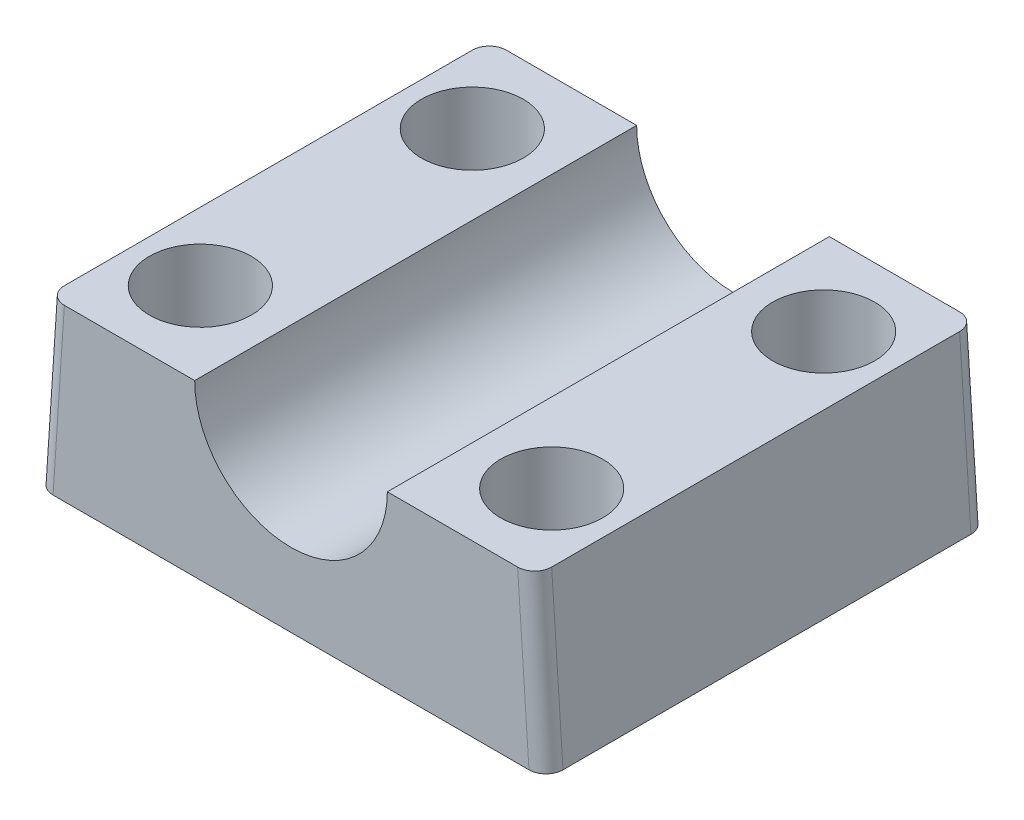
ISO-10303-21;
HEADER;
FILE_DESCRIPTION(('STEP AP214'),'2;1');
FILE_NAME('part.step','',(''),(''),'','','');
FILE_SCHEMA(('AUTOMOTIVE_DESIGN { 1 0 10303 214 1 1 1 1 }'));
ENDSEC;
DATA;
#1=APPLICATION_CONTEXT('core data for automotive mechanical design processes');
#2=APPLICATION_PROTOCOL_DEFINITION('international standard','automotive_design',2000,#1);
#3=PRODUCT_CONTEXT('',#1,'mechanical');
#4=PRODUCT('Part','Part','',(#3));
#5=PRODUCT_RELATED_PRODUCT_CATEGORY('part','',(#4));
#6=PRODUCT_DEFINITION_FORMATION('','',#4);
#7=PRODUCT_DEFINITION_CONTEXT('part definition',#1,'design');
#8=PRODUCT_DEFINITION('design','',#6,#7);
#9=PRODUCT_DEFINITION_SHAPE('','',#8);
#10=(LENGTH_UNIT() NAMED_UNIT(*) SI_UNIT(.MILLI.,.METRE.));
#11=(NAMED_UNIT(*) PLANE_ANGLE_UNIT() SI_UNIT($,.RADIAN.));
#12=(NAMED_UNIT(*) SI_UNIT($,.STERADIAN.) SOLID_ANGLE_UNIT());
#13=UNCERTAINTY_MEASURE_WITH_UNIT(LENGTH_MEASURE(1.E-05),#10,'distance_accuracy_value','');
#14=(GEOMETRIC_REPRESENTATION_CONTEXT(3) GLOBAL_UNCERTAINTY_ASSIGNED_CONTEXT((#13)) GLOBAL_UNIT_ASSIGNED_CONTEXT((#10,
#11,#12)) REPRESENTATION_CONTEXT('',''));
#15=CARTESIAN_POINT('',(0.,0.,0.));
#16=DIRECTION('',(0.,0.,1.));
#17=DIRECTION('',(1.,0.,0.));
#18=AXIS2_PLACEMENT_3D('',#15,#16,#17);
#19=CARTESIAN_POINT('',(0.,15.,39.));
#20=DIRECTION('',(0.,0.,-1.));
#21=DIRECTION('',(-1.,0.,0.));
#22=AXIS2_PLACEMENT_3D('',#19,#20,#21);
#23=CYLINDRICAL_SURFACE('',#22,8.5);
#24=CARTESIAN_POINT('',(0.,15.,0.));
#25=DIRECTION('',(0.,0.,-1.));
#26=DIRECTION('',(1.,0.,0.));
#27=AXIS2_PLACEMENT_3D('',#24,#25,#26);
#28=CIRCLE('',#27,8.5);
#29=CARTESIAN_POINT('',(8.5,15.,0.));
#30=VERTEX_POINT('',#29);
#31=CARTESIAN_POINT('',(-8.5,15.,0.));
#32=VERTEX_POINT('',#31);
#33=EDGE_CURVE('E139',#30,#32,#28,.T.);
#34=ORIENTED_EDGE('',*,*,#33,.T.);
#35=DIRECTION('',(0.,0.,-1.));
#36=VECTOR('',#35,1.);
#37=CARTESIAN_POINT('',(-8.5,15.,39.));
#38=LINE('',#37,#36);
#39=CARTESIAN_POINT('',(-8.5,15.,39.));
#40=VERTEX_POINT('',#39);
#41=EDGE_CURVE('E117',#40,#32,#38,.T.);
#42=ORIENTED_EDGE('',*,*,#41,.F.);
#43=CARTESIAN_POINT('',(0.,15.,39.));
#44=DIRECTION('',(0.,0.,-1.));
#45=DIRECTION('',(1.,0.,0.));
#46=AXIS2_PLACEMENT_3D('',#43,#44,#45);
#47=CIRCLE('',#46,8.5);
#48=CARTESIAN_POINT('',(8.5,15.,39.));
#49=VERTEX_POINT('',#48);
#50=EDGE_CURVE('E125',#49,#40,#47,.T.);
#51=ORIENTED_EDGE('',*,*,#50,.F.);
#52=DIRECTION('',(0.,0.,-1.));
#53=VECTOR('',#52,1.);
#54=CARTESIAN_POINT('',(8.5,15.,39.));
#55=LINE('',#54,#53);
#56=EDGE_CURVE('E202',#49,#30,#55,.T.);
#57=ORIENTED_EDGE('',*,*,#56,.T.);
#58=EDGE_LOOP('',(#34,#42,#51,#57));
#59=FACE_BOUND('',#58,.T.);
#60=ADVANCED_FACE('F37',(#59),#23,.F.);
#61=CARTESIAN_POINT('',(-8.5,15.,39.));
#62=DIRECTION('',(0.,-1.,0.));
#63=DIRECTION('',(1.,0.,0.));
#64=AXIS2_PLACEMENT_3D('',#61,#62,#63);
#65=PLANE('',#64);
#66=CARTESIAN_POINT('',(-15.5,15.,7.5));
#67=DIRECTION('',(0.,-1.,0.));
#68=DIRECTION('',(1.,0.,0.));
#69=AXIS2_PLACEMENT_3D('',#66,#67,#68);
#70=CIRCLE('',#69,4.49999999999999);
#71=CARTESIAN_POINT('',(-11.,15.,7.5));
#72=VERTEX_POINT('',#71);
#73=EDGE_CURVE('E417',#72,#72,#70,.T.);
#74=ORIENTED_EDGE('',*,*,#73,.T.);
#75=EDGE_LOOP('',(#74));
#76=FACE_BOUND('',#75,.T.);
#77=CARTESIAN_POINT('',(-15.5,15.,31.5));
#78=DIRECTION('',(0.,-1.,0.));
#79=DIRECTION('',(1.,0.,0.));
#80=AXIS2_PLACEMENT_3D('',#77,#78,#79);
#81=CIRCLE('',#80,4.49999999999999);
#82=CARTESIAN_POINT('',(-11.,15.,31.5));
#83=VERTEX_POINT('',#82);
#84=EDGE_CURVE('E409',#83,#83,#81,.T.);
#85=ORIENTED_EDGE('',*,*,#84,.T.);
#86=EDGE_LOOP('',(#85));
#87=FACE_BOUND('',#86,.T.);
#88=DIRECTION('',(0.,0.,-1.));
#89=VECTOR('',#88,1.);
#90=CARTESIAN_POINT('',(-21.5,15.,39.));
#91=LINE('',#90,#89);
#92=CARTESIAN_POINT('',(-21.5,15.,37.5));
#93=VERTEX_POINT('',#92);
#94=CARTESIAN_POINT('',(-21.5,15.,1.5));
#95=VERTEX_POINT('',#94);
#96=EDGE_CURVE('E141',#93,#95,#91,.T.);
#97=ORIENTED_EDGE('',*,*,#96,.F.);
#98=CARTESIAN_POINT('',(-19.9966703621627,15.,37.5));
#99=DIRECTION('',(0.,-1.,0.));
#100=DIRECTION('',(1.,0.,0.));
#101=AXIS2_PLACEMENT_3D('',#98,#99,#100);
#102=ELLIPSE('',#101,1.50332963783729,1.5);
#103=CARTESIAN_POINT('',(-19.9966703621627,15.,39.));
#104=VERTEX_POINT('',#103);
#105=EDGE_CURVE('E120',#93,#104,#102,.F.);
#106=ORIENTED_EDGE('',*,*,#105,.T.);
#107=DIRECTION('',(-1.,0.,0.));
#108=VECTOR('',#107,1.);
#109=CARTESIAN_POINT('',(-8.5,15.,39.));
#110=LINE('',#109,#108);
#111=EDGE_CURVE('E113',#40,#104,#110,.T.);
#112=ORIENTED_EDGE('',*,*,#111,.F.);
#113=ORIENTED_EDGE('',*,*,#41,.T.);
#114=DIRECTION('',(-1.,0.,0.));
#115=VECTOR('',#114,1.);
#116=CARTESIAN_POINT('',(-8.5,15.,0.));
#117=LINE('',#116,#115);
#118=CARTESIAN_POINT('',(-19.9966703621627,15.,0.));
#119=VERTEX_POINT('',#118);
#120=EDGE_CURVE('E190',#32,#119,#117,.T.);
#121=ORIENTED_EDGE('',*,*,#120,.T.);
#122=CARTESIAN_POINT('',(-19.9966703621627,15.,1.5));
#123=DIRECTION('',(0.,-1.,0.));
#124=DIRECTION('',(-1.,0.,0.));
#125=AXIS2_PLACEMENT_3D('',#122,#123,#124);
#126=ELLIPSE('',#125,1.50332963783729,1.5);
#127=EDGE_CURVE('E57',#119,#95,#126,.F.);
#128=ORIENTED_EDGE('',*,*,#127,.T.);
#129=EDGE_LOOP('',(#97,#106,#112,#113,#121,#128));
#130=FACE_BOUND('',#129,.T.);
#131=ADVANCED_FACE('F115',(#76,#87,#130),#65,.F.);
#132=CARTESIAN_POINT('',(-21.5,15.,39.));
#133=DIRECTION('',(0.997785157856609,-0.066519010523774,0.));
#134=DIRECTION('',(0.066519010523774,0.997785157856609,0.));
#135=AXIS2_PLACEMENT_3D('',#132,#133,#134);
#136=PLANE('',#135);
#137=DIRECTION('',(0.,0.,-1.));
#138=VECTOR('',#137,1.);
#139=CARTESIAN_POINT('',(-22.5,0.,39.));
#140=LINE('',#139,#138);
#141=CARTESIAN_POINT('',(-22.5,0.,37.5));
#142=VERTEX_POINT('',#141);
#143=CARTESIAN_POINT('',(-22.5,0.,1.5));
#144=VERTEX_POINT('',#143);
#145=EDGE_CURVE('E145',#142,#144,#140,.T.);
#146=ORIENTED_EDGE('',*,*,#145,.F.);
#147=DIRECTION('',(-0.066519010523774,-0.997785157856609,0.));
#148=VECTOR('',#147,1.);
#149=CARTESIAN_POINT('',(-21.5,15.,37.5));
#150=LINE('',#149,#148);
#151=EDGE_CURVE('E175',#142,#93,#150,.F.);
#152=ORIENTED_EDGE('',*,*,#151,.T.);
#153=ORIENTED_EDGE('',*,*,#96,.T.);
#154=DIRECTION('',(-0.066519010523774,-0.997785157856609,0.));
#155=VECTOR('',#154,1.);
#156=CARTESIAN_POINT('',(-21.5,15.,1.5));
#157=LINE('',#156,#155);
#158=EDGE_CURVE('E172',#95,#144,#157,.T.);
#159=ORIENTED_EDGE('',*,*,#158,.T.);
#160=EDGE_LOOP('',(#146,#152,#153,#159));
#161=FACE_BOUND('',#160,.T.);
#162=ADVANCED_FACE('F211',(#161),#136,.F.);
#163=CARTESIAN_POINT('',(-22.5,0.,39.));
#164=DIRECTION('',(0.,1.,0.));
#165=DIRECTION('',(0.,0.,1.));
#166=AXIS2_PLACEMENT_3D('',#163,#164,#165);
#167=PLANE('',#166);
#168=CARTESIAN_POINT('',(15.5,0.,7.5));
#169=DIRECTION('',(0.,-1.,0.));
#170=DIRECTION('',(0.,0.,-1.));
#171=AXIS2_PLACEMENT_3D('',#168,#169,#170);
#172=CIRCLE('',#171,4.49999999999999);
#173=CARTESIAN_POINT('',(15.5,0.,3.00000000000001));
#174=VERTEX_POINT('',#173);
#175=EDGE_CURVE('E152',#174,#174,#172,.T.);
#176=ORIENTED_EDGE('',*,*,#175,.F.);
#177=EDGE_LOOP('',(#176));
#178=FACE_BOUND('',#177,.T.);
#179=CARTESIAN_POINT('',(-15.5,0.,7.5));
#180=DIRECTION('',(0.,-1.,0.));
#181=DIRECTION('',(0.,0.,-1.));
#182=AXIS2_PLACEMENT_3D('',#179,#180,#181);
#183=CIRCLE('',#182,4.49999999999999);
#184=CARTESIAN_POINT('',(-15.5,0.,3.00000000000001));
#185=VERTEX_POINT('',#184);
#186=EDGE_CURVE('E151',#185,#185,#183,.T.);
#187=ORIENTED_EDGE('',*,*,#186,.F.);
#188=EDGE_LOOP('',(#187));
#189=FACE_BOUND('',#188,.T.);
#190=CARTESIAN_POINT('',(-15.5,0.,31.5));
#191=DIRECTION('',(0.,-1.,0.));
#192=DIRECTION('',(0.,0.,-1.));
#193=AXIS2_PLACEMENT_3D('',#190,#191,#192);
#194=CIRCLE('',#193,4.49999999999999);
#195=CARTESIAN_POINT('',(-15.5,0.,27.));
#196=VERTEX_POINT('',#195);
#197=EDGE_CURVE('E405',#196,#196,#194,.T.);
#198=ORIENTED_EDGE('',*,*,#197,.F.);
#199=EDGE_LOOP('',(#198));
#200=FACE_BOUND('',#199,.T.);
#201=CARTESIAN_POINT('',(15.5,0.,31.5));
#202=DIRECTION('',(0.,-1.,0.));
#203=DIRECTION('',(0.,0.,-1.));
#204=AXIS2_PLACEMENT_3D('',#201,#202,#203);
#205=CIRCLE('',#204,4.49999999999999);
#206=CARTESIAN_POINT('',(15.5,0.,27.));
#207=VERTEX_POINT('',#206);
#208=EDGE_CURVE('E408',#207,#207,#205,.T.);
#209=ORIENTED_EDGE('',*,*,#208,.F.);
#210=EDGE_LOOP('',(#209));
#211=FACE_BOUND('',#210,.T.);
#212=DIRECTION('',(0.,0.,-1.));
#213=VECTOR('',#212,1.);
#214=CARTESIAN_POINT('',(22.5,0.,39.));
#215=LINE('',#214,#213);
#216=CARTESIAN_POINT('',(22.5,0.,37.5));
#217=VERTEX_POINT('',#216);
#218=CARTESIAN_POINT('',(22.5,0.,1.5));
#219=VERTEX_POINT('',#218);
#220=EDGE_CURVE('E199',#217,#219,#215,.T.);
#221=ORIENTED_EDGE('',*,*,#220,.F.);
#222=CARTESIAN_POINT('',(20.9966703621627,0.,37.5));
#223=DIRECTION('',(0.,1.,0.));
#224=DIRECTION('',(1.,0.,0.));
#225=AXIS2_PLACEMENT_3D('',#222,#223,#224);
#226=ELLIPSE('',#225,1.50332963783729,1.5);
#227=CARTESIAN_POINT('',(20.9966703621627,0.,39.));
#228=VERTEX_POINT('',#227);
#229=EDGE_CURVE('E170',#217,#228,#226,.F.);
#230=ORIENTED_EDGE('',*,*,#229,.T.);
#231=DIRECTION('',(1.,0.,0.));
#232=VECTOR('',#231,1.);
#233=CARTESIAN_POINT('',(-22.5,0.,39.));
#234=LINE('',#233,#232);
#235=CARTESIAN_POINT('',(-20.9966703621627,0.,39.));
#236=VERTEX_POINT('',#235);
#237=EDGE_CURVE('E124',#236,#228,#234,.T.);
#238=ORIENTED_EDGE('',*,*,#237,.F.);
#239=CARTESIAN_POINT('',(-20.9966703621627,0.,37.5));
#240=DIRECTION('',(0.,1.,0.));
#241=DIRECTION('',(1.,0.,0.));
#242=AXIS2_PLACEMENT_3D('',#239,#240,#241);
#243=ELLIPSE('',#242,1.50332963783729,1.5);
#244=EDGE_CURVE('E168',#236,#142,#243,.F.);
#245=ORIENTED_EDGE('',*,*,#244,.T.);
#246=ORIENTED_EDGE('',*,*,#145,.T.);
#247=CARTESIAN_POINT('',(-20.9966703621627,0.,1.5));
#248=DIRECTION('',(0.,1.,0.));
#249=DIRECTION('',(-1.,0.,0.));
#250=AXIS2_PLACEMENT_3D('',#247,#248,#249);
#251=ELLIPSE('',#250,1.50332963783729,1.5);
#252=CARTESIAN_POINT('',(-20.9966703621627,0.,0.));
#253=VERTEX_POINT('',#252);
#254=EDGE_CURVE('E166',#144,#253,#251,.F.);
#255=ORIENTED_EDGE('',*,*,#254,.T.);
#256=DIRECTION('',(1.,0.,0.));
#257=VECTOR('',#256,1.);
#258=CARTESIAN_POINT('',(-22.5,0.,0.));
#259=LINE('',#258,#257);
#260=CARTESIAN_POINT('',(20.9966703621627,0.,0.));
#261=VERTEX_POINT('',#260);
#262=EDGE_CURVE('E182',#253,#261,#259,.T.);
#263=ORIENTED_EDGE('',*,*,#262,.T.);
#264=CARTESIAN_POINT('',(20.9966703621627,0.,1.5));
#265=DIRECTION('',(0.,1.,0.));
#266=DIRECTION('',(-1.,0.,0.));
#267=AXIS2_PLACEMENT_3D('',#264,#265,#266);
#268=ELLIPSE('',#267,1.50332963783729,1.5);
#269=EDGE_CURVE('E164',#261,#219,#268,.F.);
#270=ORIENTED_EDGE('',*,*,#269,.T.);
#271=EDGE_LOOP('',(#221,#230,#238,#245,#246,#255,#263,#270));
#272=FACE_BOUND('',#271,.T.);
#273=ADVANCED_FACE('F187',(#178,#189,#200,#211,#272),#167,.F.);
#274=CARTESIAN_POINT('',(22.5,0.,39.));
#275=DIRECTION('',(-0.997785157856609,-0.066519010523774,0.));
#276=DIRECTION('',(0.066519010523774,-0.997785157856609,0.));
#277=AXIS2_PLACEMENT_3D('',#274,#275,#276);
#278=PLANE('',#277);
#279=DIRECTION('',(0.,0.,-1.));
#280=VECTOR('',#279,1.);
#281=CARTESIAN_POINT('',(21.5,15.,39.));
#282=LINE('',#281,#280);
#283=CARTESIAN_POINT('',(21.5,15.,37.5));
#284=VERTEX_POINT('',#283);
#285=CARTESIAN_POINT('',(21.5,15.,1.5));
#286=VERTEX_POINT('',#285);
#287=EDGE_CURVE('E197',#284,#286,#282,.T.);
#288=ORIENTED_EDGE('',*,*,#287,.F.);
#289=DIRECTION('',(-0.066519010523774,0.997785157856609,0.));
#290=VECTOR('',#289,1.);
#291=CARTESIAN_POINT('',(22.5,0.,37.5));
#292=LINE('',#291,#290);
#293=EDGE_CURVE('E162',#284,#217,#292,.F.);
#294=ORIENTED_EDGE('',*,*,#293,.T.);
#295=ORIENTED_EDGE('',*,*,#220,.T.);
#296=DIRECTION('',(-0.066519010523774,0.997785157856609,0.));
#297=VECTOR('',#296,1.);
#298=CARTESIAN_POINT('',(22.5,0.,1.5));
#299=LINE('',#298,#297);
#300=EDGE_CURVE('E159',#219,#286,#299,.T.);
#301=ORIENTED_EDGE('',*,*,#300,.T.);
#302=EDGE_LOOP('',(#288,#294,#295,#301));
#303=FACE_BOUND('',#302,.T.);
#304=ADVANCED_FACE('F196',(#303),#278,.F.);
#305=CARTESIAN_POINT('',(21.5,15.,39.));
#306=DIRECTION('',(0.,-1.,0.));
#307=DIRECTION('',(1.,0.,0.));
#308=AXIS2_PLACEMENT_3D('',#305,#306,#307);
#309=PLANE('',#308);
#310=CARTESIAN_POINT('',(15.5,15.,7.5));
#311=DIRECTION('',(0.,-1.,0.));
#312=DIRECTION('',(1.,0.,0.));
#313=AXIS2_PLACEMENT_3D('',#310,#311,#312);
#314=CIRCLE('',#313,4.49999999999999);
#315=CARTESIAN_POINT('',(20.,15.,7.5));
#316=VERTEX_POINT('',#315);
#317=EDGE_CURVE('E149',#316,#316,#314,.T.);
#318=ORIENTED_EDGE('',*,*,#317,.T.);
#319=EDGE_LOOP('',(#318));
#320=FACE_BOUND('',#319,.T.);
#321=CARTESIAN_POINT('',(15.5,15.,31.5));
#322=DIRECTION('',(0.,-1.,0.));
#323=DIRECTION('',(1.,0.,0.));
#324=AXIS2_PLACEMENT_3D('',#321,#322,#323);
#325=CIRCLE('',#324,4.49999999999999);
#326=CARTESIAN_POINT('',(20.,15.,31.5));
#327=VERTEX_POINT('',#326);
#328=EDGE_CURVE('E221',#327,#327,#325,.T.);
#329=ORIENTED_EDGE('',*,*,#328,.T.);
#330=EDGE_LOOP('',(#329));
#331=FACE_BOUND('',#330,.T.);
#332=DIRECTION('',(-1.,0.,0.));
#333=VECTOR('',#332,1.);
#334=CARTESIAN_POINT('',(21.5,15.,39.));
#335=LINE('',#334,#333);
#336=CARTESIAN_POINT('',(19.9966703621627,15.,39.));
#337=VERTEX_POINT('',#336);
#338=EDGE_CURVE('E132',#337,#49,#335,.T.);
#339=ORIENTED_EDGE('',*,*,#338,.F.);
#340=CARTESIAN_POINT('',(19.9966703621627,15.,37.5));
#341=DIRECTION('',(0.,-1.,0.));
#342=DIRECTION('',(1.,0.,0.));
#343=AXIS2_PLACEMENT_3D('',#340,#341,#342);
#344=ELLIPSE('',#343,1.50332963783729,1.5);
#345=EDGE_CURVE('E157',#337,#284,#344,.F.);
#346=ORIENTED_EDGE('',*,*,#345,.T.);
#347=ORIENTED_EDGE('',*,*,#287,.T.);
#348=CARTESIAN_POINT('',(19.9966703621627,15.,1.5));
#349=DIRECTION('',(0.,-1.,0.));
#350=DIRECTION('',(-1.,0.,0.));
#351=AXIS2_PLACEMENT_3D('',#348,#349,#350);
#352=ELLIPSE('',#351,1.50332963783729,1.5);
#353=CARTESIAN_POINT('',(19.9966703621627,15.,0.));
#354=VERTEX_POINT('',#353);
#355=EDGE_CURVE('E155',#286,#354,#352,.F.);
#356=ORIENTED_EDGE('',*,*,#355,.T.);
#357=DIRECTION('',(-1.,0.,0.));
#358=VECTOR('',#357,1.);
#359=CARTESIAN_POINT('',(21.5,15.,0.));
#360=LINE('',#359,#358);
#361=EDGE_CURVE('E136',#354,#30,#360,.T.);
#362=ORIENTED_EDGE('',*,*,#361,.T.);
#363=ORIENTED_EDGE('',*,*,#56,.F.);
#364=EDGE_LOOP('',(#339,#346,#347,#356,#362,#363));
#365=FACE_BOUND('',#364,.T.);
#366=ADVANCED_FACE('F201',(#320,#331,#365),#309,.F.);
#367=CARTESIAN_POINT('',(0.,15.,39.));
#368=DIRECTION('',(0.,0.,1.));
#369=DIRECTION('',(1.,0.,0.));
#370=AXIS2_PLACEMENT_3D('',#367,#368,#369);
#371=PLANE('',#370);
#372=ORIENTED_EDGE('',*,*,#237,.T.);
#373=DIRECTION('',(-0.066519010523774,0.997785157856609,0.));
#374=VECTOR('',#373,1.);
#375=CARTESIAN_POINT('',(20.0033222632151,14.9002214842143,39.));
#376=LINE('',#375,#374);
#377=EDGE_CURVE('E143',#228,#337,#376,.T.);
#378=ORIENTED_EDGE('',*,*,#377,.T.);
#379=ORIENTED_EDGE('',*,*,#338,.T.);
#380=ORIENTED_EDGE('',*,*,#50,.T.);
#381=ORIENTED_EDGE('',*,*,#111,.T.);
#382=DIRECTION('',(-0.066519010523774,-0.997785157856609,0.));
#383=VECTOR('',#382,1.);
#384=CARTESIAN_POINT('',(-21.0033222632151,-0.0997785157856625,39.));
#385=LINE('',#384,#383);
#386=EDGE_CURVE('E140',#104,#236,#385,.T.);
#387=ORIENTED_EDGE('',*,*,#386,.T.);
#388=EDGE_LOOP('',(#372,#378,#379,#380,#381,#387));
#389=FACE_BOUND('',#388,.T.);
#390=ADVANCED_FACE('F129',(#389),#371,.T.);
#391=CARTESIAN_POINT('',(0.,15.,0.));
#392=DIRECTION('',(0.,0.,1.));
#393=DIRECTION('',(1.,0.,0.));
#394=AXIS2_PLACEMENT_3D('',#391,#392,#393);
#395=PLANE('',#394);
#396=ORIENTED_EDGE('',*,*,#262,.F.);
#397=DIRECTION('',(-0.066519010523774,-0.997785157856609,0.));
#398=VECTOR('',#397,1.);
#399=CARTESIAN_POINT('',(-19.9081895198523,16.3272126346568,0.));
#400=LINE('',#399,#398);
#401=EDGE_CURVE('E11',#253,#119,#400,.F.);
#402=ORIENTED_EDGE('',*,*,#401,.T.);
#403=ORIENTED_EDGE('',*,*,#120,.F.);
#404=ORIENTED_EDGE('',*,*,#33,.F.);
#405=ORIENTED_EDGE('',*,*,#361,.F.);
#406=DIRECTION('',(-0.066519010523774,0.997785157856609,0.));
#407=VECTOR('',#406,1.);
#408=CARTESIAN_POINT('',(19.9081895198523,16.3272126346568,0.));
#409=LINE('',#408,#407);
#410=EDGE_CURVE('E45',#354,#261,#409,.F.);
#411=ORIENTED_EDGE('',*,*,#410,.T.);
#412=EDGE_LOOP('',(#396,#402,#403,#404,#405,#411));
#413=FACE_BOUND('',#412,.T.);
#414=ADVANCED_FACE('F181',(#413),#395,.F.);
#415=CARTESIAN_POINT('',(15.5,0.,31.5));
#416=DIRECTION('',(0.,-1.,0.));
#417=DIRECTION('',(0.,0.,-1.));
#418=AXIS2_PLACEMENT_3D('',#415,#416,#417);
#419=CYLINDRICAL_SURFACE('',#418,4.49999999999999);
#420=ORIENTED_EDGE('',*,*,#208,.T.);
#421=EDGE_LOOP('',(#420));
#422=FACE_BOUND('',#421,.T.);
#423=ORIENTED_EDGE('',*,*,#328,.F.);
#424=EDGE_LOOP('',(#423));
#425=FACE_BOUND('',#424,.T.);
#426=ADVANCED_FACE('F260',(#422,#425),#419,.F.);
#427=CARTESIAN_POINT('',(-15.5,0.,31.5));
#428=DIRECTION('',(0.,-1.,0.));
#429=DIRECTION('',(0.,0.,-1.));
#430=AXIS2_PLACEMENT_3D('',#427,#428,#429);
#431=CYLINDRICAL_SURFACE('',#430,4.49999999999999);
#432=ORIENTED_EDGE('',*,*,#197,.T.);
#433=EDGE_LOOP('',(#432));
#434=FACE_BOUND('',#433,.T.);
#435=ORIENTED_EDGE('',*,*,#84,.F.);
#436=EDGE_LOOP('',(#435));
#437=FACE_BOUND('',#436,.T.);
#438=ADVANCED_FACE('F252',(#434,#437),#431,.F.);
#439=CARTESIAN_POINT('',(-15.5,0.,7.5));
#440=DIRECTION('',(0.,-1.,0.));
#441=DIRECTION('',(0.,0.,-1.));
#442=AXIS2_PLACEMENT_3D('',#439,#440,#441);
#443=CYLINDRICAL_SURFACE('',#442,4.49999999999999);
#444=ORIENTED_EDGE('',*,*,#186,.T.);
#445=EDGE_LOOP('',(#444));
#446=FACE_BOUND('',#445,.T.);
#447=ORIENTED_EDGE('',*,*,#73,.F.);
#448=EDGE_LOOP('',(#447));
#449=FACE_BOUND('',#448,.T.);
#450=ADVANCED_FACE('F246',(#446,#449),#443,.F.);
#451=CARTESIAN_POINT('',(15.5,0.,7.5));
#452=DIRECTION('',(0.,-1.,0.));
#453=DIRECTION('',(0.,0.,-1.));
#454=AXIS2_PLACEMENT_3D('',#451,#452,#453);
#455=CYLINDRICAL_SURFACE('',#454,4.49999999999999);
#456=ORIENTED_EDGE('',*,*,#175,.T.);
#457=EDGE_LOOP('',(#456));
#458=FACE_BOUND('',#457,.T.);
#459=ORIENTED_EDGE('',*,*,#317,.F.);
#460=EDGE_LOOP('',(#459));
#461=FACE_BOUND('',#460,.T.);
#462=ADVANCED_FACE('F241',(#458,#461),#455,.F.);
#463=CARTESIAN_POINT('',(19.9081895198523,16.3272126346568,37.5));
#464=DIRECTION('',(0.066519010523774,-0.997785157856609,0.));
#465=DIRECTION('',(0.997785157856609,0.066519010523774,0.));
#466=AXIS2_PLACEMENT_3D('',#463,#464,#465);
#467=CYLINDRICAL_SURFACE('',#466,1.5);
#468=ORIENTED_EDGE('',*,*,#229,.F.);
#469=ORIENTED_EDGE('',*,*,#293,.F.);
#470=ORIENTED_EDGE('',*,*,#345,.F.);
#471=ORIENTED_EDGE('',*,*,#377,.F.);
#472=EDGE_LOOP('',(#468,#469,#470,#471));
#473=FACE_BOUND('',#472,.T.);
#474=ADVANCED_FACE('F229',(#473),#467,.T.);
#475=CARTESIAN_POINT('',(-19.9081895198523,16.3272126346568,37.5));
#476=DIRECTION('',(0.066519010523774,0.997785157856609,0.));
#477=DIRECTION('',(-0.997785157856609,0.066519010523774,0.));
#478=AXIS2_PLACEMENT_3D('',#475,#476,#477);
#479=CYLINDRICAL_SURFACE('',#478,1.5);
#480=ORIENTED_EDGE('',*,*,#105,.F.);
#481=ORIENTED_EDGE('',*,*,#151,.F.);
#482=ORIENTED_EDGE('',*,*,#244,.F.);
#483=ORIENTED_EDGE('',*,*,#386,.F.);
#484=EDGE_LOOP('',(#480,#481,#482,#483));
#485=FACE_BOUND('',#484,.T.);
#486=ADVANCED_FACE('F214',(#485),#479,.T.);
#487=CARTESIAN_POINT('',(-20.0033222632151,14.9002214842143,1.5));
#488=DIRECTION('',(-0.066519010523774,-0.997785157856609,0.));
#489=DIRECTION('',(0.997785157856609,-0.066519010523774,0.));
#490=AXIS2_PLACEMENT_3D('',#487,#488,#489);
#491=CYLINDRICAL_SURFACE('',#490,1.5);
#492=ORIENTED_EDGE('',*,*,#127,.F.);
#493=ORIENTED_EDGE('',*,*,#401,.F.);
#494=ORIENTED_EDGE('',*,*,#254,.F.);
#495=ORIENTED_EDGE('',*,*,#158,.F.);
#496=EDGE_LOOP('',(#492,#493,#494,#495));
#497=FACE_BOUND('',#496,.T.);
#498=ADVANCED_FACE('F223',(#497),#491,.T.);
#499=CARTESIAN_POINT('',(21.0033222632151,-0.099778515785661,1.5));
#500=DIRECTION('',(-0.066519010523774,0.997785157856609,0.));
#501=DIRECTION('',(-0.997785157856609,-0.066519010523774,0.));
#502=AXIS2_PLACEMENT_3D('',#499,#500,#501);
#503=CYLINDRICAL_SURFACE('',#502,1.5);
#504=ORIENTED_EDGE('',*,*,#269,.F.);
#505=ORIENTED_EDGE('',*,*,#410,.F.);
#506=ORIENTED_EDGE('',*,*,#355,.F.);
#507=ORIENTED_EDGE('',*,*,#300,.F.);
#508=EDGE_LOOP('',(#504,#505,#506,#507));
#509=FACE_BOUND('',#508,.T.);
#510=ADVANCED_FACE('F39',(#509),#503,.T.);
#511=CLOSED_SHELL('',(#60,#131,#162,#273,#304,#366,#390,#414,#426,#438,#450,#462,#474,#486,#498,#510));
#512=MANIFOLD_SOLID_BREP('B2',#511);
#513=ADVANCED_BREP_SHAPE_REPRESENTATION('',(#18,#512),#14);
#514=SHAPE_DEFINITION_REPRESENTATION(#9,#513);
ENDSEC;
END-ISO-10303-21;
